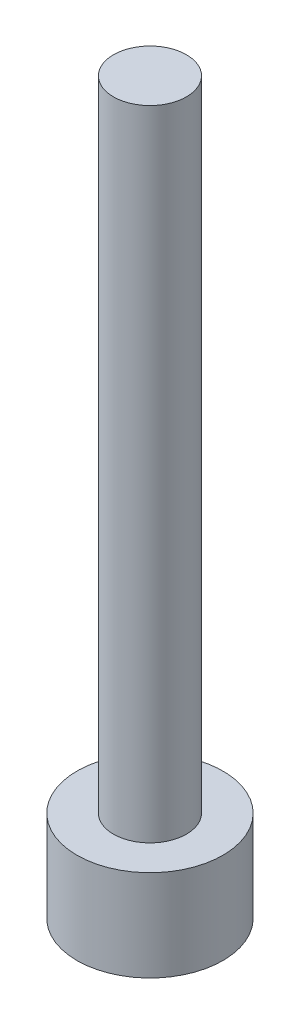
ISO-10303-21;
HEADER;
FILE_DESCRIPTION(('STEP AP214'),'2;1');
FILE_NAME('part.step','',(''),(''),'','','');
FILE_SCHEMA(('AUTOMOTIVE_DESIGN { 1 0 10303 214 1 1 1 1 }'));
ENDSEC;
DATA;
#1=APPLICATION_CONTEXT('core data for automotive mechanical design processes');
#2=APPLICATION_PROTOCOL_DEFINITION('international standard','automotive_design',2000,#1);
#3=PRODUCT_CONTEXT('',#1,'mechanical');
#4=PRODUCT('Part','Part','',(#3));
#5=PRODUCT_RELATED_PRODUCT_CATEGORY('part','',(#4));
#6=PRODUCT_DEFINITION_FORMATION('','',#4);
#7=PRODUCT_DEFINITION_CONTEXT('part definition',#1,'design');
#8=PRODUCT_DEFINITION('design','',#6,#7);
#9=PRODUCT_DEFINITION_SHAPE('','',#8);
#10=(LENGTH_UNIT() NAMED_UNIT(*) SI_UNIT(.MILLI.,.METRE.));
#11=(NAMED_UNIT(*) PLANE_ANGLE_UNIT() SI_UNIT($,.RADIAN.));
#12=(NAMED_UNIT(*) SI_UNIT($,.STERADIAN.) SOLID_ANGLE_UNIT());
#13=UNCERTAINTY_MEASURE_WITH_UNIT(LENGTH_MEASURE(1.E-05),#10,'distance_accuracy_value','');
#14=(GEOMETRIC_REPRESENTATION_CONTEXT(3) GLOBAL_UNCERTAINTY_ASSIGNED_CONTEXT((#13)) GLOBAL_UNIT_ASSIGNED_CONTEXT((#10,
#11,#12)) REPRESENTATION_CONTEXT('',''));
#15=CARTESIAN_POINT('',(0.,0.,0.));
#16=DIRECTION('',(0.,0.,1.));
#17=DIRECTION('',(1.,0.,0.));
#18=AXIS2_PLACEMENT_3D('',#15,#16,#17);
#19=CARTESIAN_POINT('',(0.,5.,0.));
#20=DIRECTION('',(0.,-1.,0.));
#21=DIRECTION('',(0.,0.,-1.));
#22=AXIS2_PLACEMENT_3D('',#19,#20,#21);
#23=CYLINDRICAL_SURFACE('',#22,4.);
#24=CARTESIAN_POINT('',(0.,5.,0.));
#25=DIRECTION('',(0.,1.,0.));
#26=DIRECTION('',(0.,0.,1.));
#27=AXIS2_PLACEMENT_3D('',#24,#25,#26);
#28=CIRCLE('',#27,4.);
#29=CARTESIAN_POINT('',(0.,5.,4.));
#30=VERTEX_POINT('',#29);
#31=EDGE_CURVE('E42',#30,#30,#28,.T.);
#32=ORIENTED_EDGE('',*,*,#31,.F.);
#33=EDGE_LOOP('',(#32));
#34=FACE_BOUND('',#33,.T.);
#35=CARTESIAN_POINT('',(0.,0.,0.));
#36=DIRECTION('',(0.,1.,0.));
#37=DIRECTION('',(0.,0.,1.));
#38=AXIS2_PLACEMENT_3D('',#35,#36,#37);
#39=CIRCLE('',#38,4.);
#40=CARTESIAN_POINT('',(0.,0.,4.));
#41=VERTEX_POINT('',#40);
#42=EDGE_CURVE('E38',#41,#41,#39,.T.);
#43=ORIENTED_EDGE('',*,*,#42,.T.);
#44=EDGE_LOOP('',(#43));
#45=FACE_BOUND('',#44,.T.);
#46=ADVANCED_FACE('F35',(#34,#45),#23,.T.);
#47=CARTESIAN_POINT('',(0.,5.,0.));
#48=DIRECTION('',(0.,1.,0.));
#49=DIRECTION('',(0.,0.,1.));
#50=AXIS2_PLACEMENT_3D('',#47,#48,#49);
#51=PLANE('',#50);
#52=CARTESIAN_POINT('',(0.,5.,0.));
#53=DIRECTION('',(0.,1.,0.));
#54=DIRECTION('',(0.,0.,1.));
#55=AXIS2_PLACEMENT_3D('',#52,#53,#54);
#56=CIRCLE('',#55,2.);
#57=CARTESIAN_POINT('',(0.,5.,2.));
#58=VERTEX_POINT('',#57);
#59=EDGE_CURVE('E10',#58,#58,#56,.T.);
#60=ORIENTED_EDGE('',*,*,#59,.F.);
#61=EDGE_LOOP('',(#60));
#62=FACE_BOUND('',#61,.T.);
#63=ORIENTED_EDGE('',*,*,#31,.T.);
#64=EDGE_LOOP('',(#63));
#65=FACE_BOUND('',#64,.T.);
#66=ADVANCED_FACE('F59',(#62,#65),#51,.T.);
#67=CARTESIAN_POINT('',(0.,0.,0.));
#68=DIRECTION('',(0.,1.,0.));
#69=DIRECTION('',(0.,0.,1.));
#70=AXIS2_PLACEMENT_3D('',#67,#68,#69);
#71=PLANE('',#70);
#72=ORIENTED_EDGE('',*,*,#42,.F.);
#73=EDGE_LOOP('',(#72));
#74=FACE_BOUND('',#73,.T.);
#75=ADVANCED_FACE('F56',(#74),#71,.F.);
#76=CARTESIAN_POINT('',(0.,40.,0.));
#77=DIRECTION('',(0.,-1.,0.));
#78=DIRECTION('',(0.,0.,-1.));
#79=AXIS2_PLACEMENT_3D('',#76,#77,#78);
#80=CYLINDRICAL_SURFACE('',#79,2.);
#81=CARTESIAN_POINT('',(0.,40.,0.));
#82=DIRECTION('',(0.,1.,0.));
#83=DIRECTION('',(0.,0.,1.));
#84=AXIS2_PLACEMENT_3D('',#81,#82,#83);
#85=CIRCLE('',#84,2.);
#86=CARTESIAN_POINT('',(0.,40.,2.));
#87=VERTEX_POINT('',#86);
#88=EDGE_CURVE('E48',#87,#87,#85,.T.);
#89=ORIENTED_EDGE('',*,*,#88,.F.);
#90=EDGE_LOOP('',(#89));
#91=FACE_BOUND('',#90,.T.);
#92=ORIENTED_EDGE('',*,*,#59,.T.);
#93=EDGE_LOOP('',(#92));
#94=FACE_BOUND('',#93,.T.);
#95=ADVANCED_FACE('F58',(#91,#94),#80,.T.);
#96=CARTESIAN_POINT('',(0.,40.,0.));
#97=DIRECTION('',(0.,1.,0.));
#98=DIRECTION('',(0.,0.,1.));
#99=AXIS2_PLACEMENT_3D('',#96,#97,#98);
#100=PLANE('',#99);
#101=ORIENTED_EDGE('',*,*,#88,.T.);
#102=EDGE_LOOP('',(#101));
#103=FACE_BOUND('',#102,.T.);
#104=ADVANCED_FACE('F64',(#103),#100,.T.);
#105=CLOSED_SHELL('',(#46,#66,#75,#95,#104));
#106=MANIFOLD_SOLID_BREP('B2',#105);
#107=ADVANCED_BREP_SHAPE_REPRESENTATION('',(#18,#106),#14);
#108=SHAPE_DEFINITION_REPRESENTATION(#9,#107);
ENDSEC;
END-ISO-10303-21;
